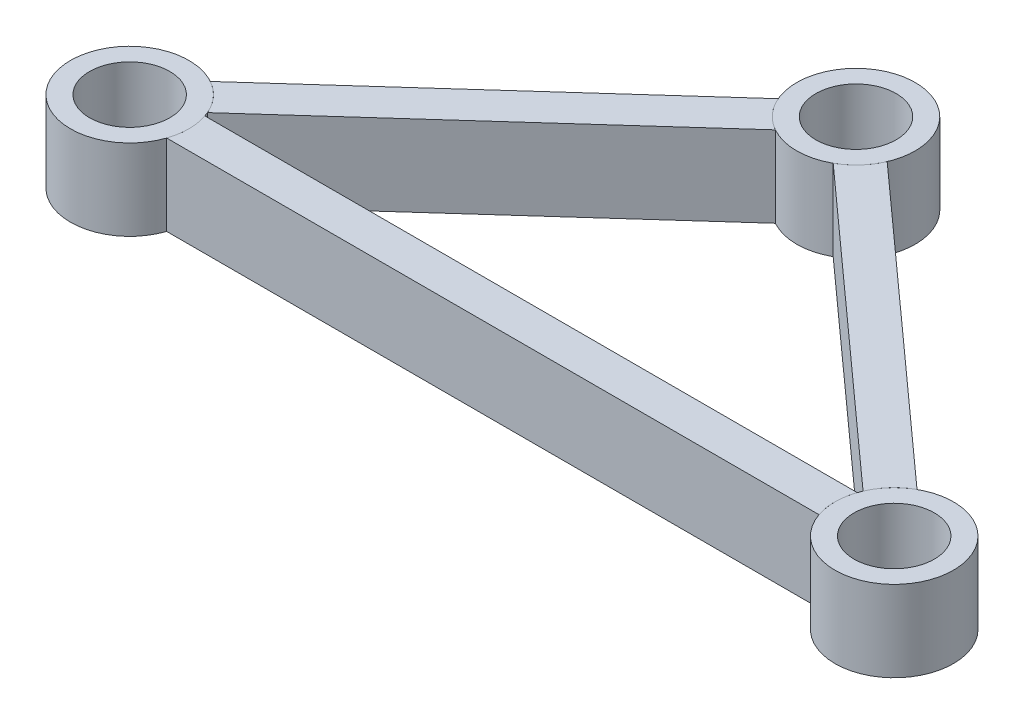
ISO-10303-21;
HEADER;
FILE_DESCRIPTION(('STEP AP214'),'2;1');
FILE_NAME('part.step','',(''),(''),'','','');
FILE_SCHEMA(('AUTOMOTIVE_DESIGN { 1 0 10303 214 1 1 1 1 }'));
ENDSEC;
DATA;
#1=APPLICATION_CONTEXT('core data for automotive mechanical design processes');
#2=APPLICATION_PROTOCOL_DEFINITION('international standard','automotive_design',2000,#1);
#3=PRODUCT_CONTEXT('',#1,'mechanical');
#4=PRODUCT('Part','Part','',(#3));
#5=PRODUCT_RELATED_PRODUCT_CATEGORY('part','',(#4));
#6=PRODUCT_DEFINITION_FORMATION('','',#4);
#7=PRODUCT_DEFINITION_CONTEXT('part definition',#1,'design');
#8=PRODUCT_DEFINITION('design','',#6,#7);
#9=PRODUCT_DEFINITION_SHAPE('','',#8);
#10=(LENGTH_UNIT() NAMED_UNIT(*) SI_UNIT(.MILLI.,.METRE.));
#11=(NAMED_UNIT(*) PLANE_ANGLE_UNIT() SI_UNIT($,.RADIAN.));
#12=(NAMED_UNIT(*) SI_UNIT($,.STERADIAN.) SOLID_ANGLE_UNIT());
#13=UNCERTAINTY_MEASURE_WITH_UNIT(LENGTH_MEASURE(1.E-05),#10,'distance_accuracy_value','');
#14=(GEOMETRIC_REPRESENTATION_CONTEXT(3) GLOBAL_UNCERTAINTY_ASSIGNED_CONTEXT((#13)) GLOBAL_UNIT_ASSIGNED_CONTEXT((#10,
#11,#12)) REPRESENTATION_CONTEXT('',''));
#15=CARTESIAN_POINT('',(0.,0.,0.));
#16=DIRECTION('',(0.,0.,1.));
#17=DIRECTION('',(1.,0.,0.));
#18=AXIS2_PLACEMENT_3D('',#15,#16,#17);
#19=CARTESIAN_POINT('',(60.,6.35,27.));
#20=DIRECTION('',(0.,-1.,0.));
#21=DIRECTION('',(0.,0.,-1.));
#22=AXIS2_PLACEMENT_3D('',#19,#20,#21);
#23=CYLINDRICAL_SURFACE('',#22,9.30000000000001);
#24=DIRECTION('',(0.,-1.,0.));
#25=VECTOR('',#24,1.);
#26=CARTESIAN_POINT('',(51.4500060278057,6.35,23.3410926391283));
#27=LINE('',#26,#25);
#28=CARTESIAN_POINT('',(51.4500060278057,6.35,23.3410926391283));
#29=VERTEX_POINT('',#28);
#30=CARTESIAN_POINT('',(51.4500060278057,-6.35,23.3410926391283));
#31=VERTEX_POINT('',#30);
#32=EDGE_CURVE('E115',#29,#31,#27,.T.);
#33=ORIENTED_EDGE('',*,*,#32,.T.);
#34=CARTESIAN_POINT('',(60.,-6.35,27.));
#35=DIRECTION('',(0.,1.,0.));
#36=DIRECTION('',(0.,0.,1.));
#37=AXIS2_PLACEMENT_3D('',#34,#35,#36);
#38=CIRCLE('',#37,9.30000000000001);
#39=CARTESIAN_POINT('',(55.4637944174488,-6.35,18.8813277615623));
#40=VERTEX_POINT('',#39);
#41=EDGE_CURVE('E61',#40,#31,#38,.T.);
#42=ORIENTED_EDGE('',*,*,#41,.F.);
#43=DIRECTION('',(0.,-1.,0.));
#44=VECTOR('',#43,1.);
#45=CARTESIAN_POINT('',(55.4637944175215,6.35,18.8813277616662));
#46=LINE('',#45,#44);
#47=CARTESIAN_POINT('',(55.4637944175215,6.35,18.8813277616662));
#48=VERTEX_POINT('',#47);
#49=EDGE_CURVE('E69',#40,#48,#46,.F.);
#50=ORIENTED_EDGE('',*,*,#49,.T.);
#51=CARTESIAN_POINT('',(60.,6.35,27.));
#52=DIRECTION('',(0.,-1.,0.));
#53=DIRECTION('',(0.,0.,-1.));
#54=AXIS2_PLACEMENT_3D('',#51,#52,#53);
#55=CIRCLE('',#54,9.30000000000001);
#56=EDGE_CURVE('E48',#48,#29,#55,.F.);
#57=ORIENTED_EDGE('',*,*,#56,.T.);
#58=EDGE_LOOP('',(#33,#42,#50,#57));
#59=FACE_BOUND('',#58,.T.);
#60=ADVANCED_FACE('F44',(#59),#23,.F.);
#61=CARTESIAN_POINT('',(500000.,-6.35,449977.036087214));
#62=DIRECTION('',(0.,1.,0.));
#63=DIRECTION('',(0.,0.,1.));
#64=AXIS2_PLACEMENT_3D('',#61,#62,#63);
#65=PLANE('',#64);
#66=DIRECTION('',(-0.743294146247166,0.,-0.66896473162245));
#67=VECTOR('',#66,1.);
#68=CARTESIAN_POINT('',(500004.01378839,-6.35,449972.576322336));
#69=LINE('',#68,#67);
#70=CARTESIAN_POINT('',(8.549993972224,-6.35,-23.3410926391571));
#71=VERTEX_POINT('',#70);
#72=EDGE_CURVE('E93',#40,#71,#69,.T.);
#73=ORIENTED_EDGE('',*,*,#72,.F.);
#74=ORIENTED_EDGE('',*,*,#41,.T.);
#75=DIRECTION('',(-0.743294146247166,0.,-0.66896473162245));
#76=VECTOR('',#75,1.);
#77=CARTESIAN_POINT('',(500000.,-6.35,449977.036087214));
#78=LINE('',#77,#76);
#79=CARTESIAN_POINT('',(4.53620558247847,-6.35,-18.8813277616662));
#80=VERTEX_POINT('',#79);
#81=EDGE_CURVE('E86',#31,#80,#78,.T.);
#82=ORIENTED_EDGE('',*,*,#81,.T.);
#83=CARTESIAN_POINT('',(0.,-6.35,-27.));
#84=DIRECTION('',(0.,1.,0.));
#85=DIRECTION('',(0.,0.,1.));
#86=AXIS2_PLACEMENT_3D('',#83,#84,#85);
#87=CIRCLE('',#86,9.3);
#88=EDGE_CURVE('E89',#80,#71,#87,.T.);
#89=ORIENTED_EDGE('',*,*,#88,.T.);
#90=EDGE_LOOP('',(#73,#74,#82,#89));
#91=FACE_BOUND('',#90,.T.);
#92=ADVANCED_FACE('F88',(#91),#65,.F.);
#93=CARTESIAN_POINT('',(500000.,6.35,449977.036087214));
#94=DIRECTION('',(0.66896473162245,0.,-0.743294146247166));
#95=DIRECTION('',(-0.743294146247166,0.,-0.66896473162245));
#96=AXIS2_PLACEMENT_3D('',#93,#94,#95);
#97=PLANE('',#96);
#98=ORIENTED_EDGE('',*,*,#32,.F.);
#99=DIRECTION('',(-0.743294146247166,0.,-0.66896473162245));
#100=VECTOR('',#99,1.);
#101=CARTESIAN_POINT('',(500000.,6.35,449977.036087214));
#102=LINE('',#101,#100);
#103=CARTESIAN_POINT('',(4.53620558247847,6.35,-18.8813277616662));
#104=VERTEX_POINT('',#103);
#105=EDGE_CURVE('E12',#29,#104,#102,.T.);
#106=ORIENTED_EDGE('',*,*,#105,.T.);
#107=DIRECTION('',(0.,-1.,0.));
#108=VECTOR('',#107,1.);
#109=CARTESIAN_POINT('',(4.53620558247847,6.35,-18.8813277616662));
#110=LINE('',#109,#108);
#111=EDGE_CURVE('E100',#104,#80,#110,.T.);
#112=ORIENTED_EDGE('',*,*,#111,.T.);
#113=ORIENTED_EDGE('',*,*,#81,.F.);
#114=EDGE_LOOP('',(#98,#106,#112,#113));
#115=FACE_BOUND('',#114,.T.);
#116=ADVANCED_FACE('F104',(#115),#97,.F.);
#117=CARTESIAN_POINT('',(500004.01378839,6.35,449972.576322336));
#118=DIRECTION('',(-0.66896473162245,0.,0.743294146247166));
#119=DIRECTION('',(0.743294146247166,0.,0.66896473162245));
#120=AXIS2_PLACEMENT_3D('',#117,#118,#119);
#121=PLANE('',#120);
#122=ORIENTED_EDGE('',*,*,#49,.F.);
#123=ORIENTED_EDGE('',*,*,#72,.T.);
#124=DIRECTION('',(0.,-1.,0.));
#125=VECTOR('',#124,1.);
#126=CARTESIAN_POINT('',(8.54999397221793,6.35,-23.3410926391835));
#127=LINE('',#126,#125);
#128=CARTESIAN_POINT('',(8.54999397221793,6.35,-23.3410926391835));
#129=VERTEX_POINT('',#128);
#130=EDGE_CURVE('E102',#71,#129,#127,.F.);
#131=ORIENTED_EDGE('',*,*,#130,.T.);
#132=DIRECTION('',(-0.743294146247166,0.,-0.66896473162245));
#133=VECTOR('',#132,1.);
#134=CARTESIAN_POINT('',(500004.01378839,6.35,449972.576322336));
#135=LINE('',#134,#133);
#136=EDGE_CURVE('E53',#48,#129,#135,.T.);
#137=ORIENTED_EDGE('',*,*,#136,.F.);
#138=EDGE_LOOP('',(#122,#123,#131,#137));
#139=FACE_BOUND('',#138,.T.);
#140=ADVANCED_FACE('F118',(#139),#121,.F.);
#141=CARTESIAN_POINT('',(500000.,6.35,449977.036087214));
#142=DIRECTION('',(0.,-1.,0.));
#143=DIRECTION('',(0.,0.,-1.));
#144=AXIS2_PLACEMENT_3D('',#141,#142,#143);
#145=PLANE('',#144);
#146=ORIENTED_EDGE('',*,*,#56,.F.);
#147=ORIENTED_EDGE('',*,*,#136,.T.);
#148=CARTESIAN_POINT('',(0.,6.35,-27.));
#149=DIRECTION('',(0.,1.,0.));
#150=DIRECTION('',(0.,0.,1.));
#151=AXIS2_PLACEMENT_3D('',#148,#149,#150);
#152=CIRCLE('',#151,9.3);
#153=EDGE_CURVE('E110',#129,#104,#152,.F.);
#154=ORIENTED_EDGE('',*,*,#153,.T.);
#155=ORIENTED_EDGE('',*,*,#105,.F.);
#156=EDGE_LOOP('',(#146,#147,#154,#155));
#157=FACE_BOUND('',#156,.T.);
#158=ADVANCED_FACE('F46',(#157),#145,.F.);
#159=CARTESIAN_POINT('',(0.,6.35,-27.));
#160=DIRECTION('',(0.,-1.,0.));
#161=DIRECTION('',(0.,0.,-1.));
#162=AXIS2_PLACEMENT_3D('',#159,#160,#161);
#163=CYLINDRICAL_SURFACE('',#162,9.3);
#164=ORIENTED_EDGE('',*,*,#88,.F.);
#165=ORIENTED_EDGE('',*,*,#111,.F.);
#166=ORIENTED_EDGE('',*,*,#153,.F.);
#167=ORIENTED_EDGE('',*,*,#130,.F.);
#168=EDGE_LOOP('',(#164,#165,#166,#167));
#169=FACE_BOUND('',#168,.T.);
#170=ADVANCED_FACE('F98',(#169),#163,.F.);
#171=CLOSED_SHELL('',(#60,#92,#116,#140,#158,#170));
#172=MANIFOLD_SOLID_BREP('B2',#171);
#173=CARTESIAN_POINT('',(-60.,6.35,27.));
#174=DIRECTION('',(0.,-1.,0.));
#175=DIRECTION('',(0.,0.,-1.));
#176=AXIS2_PLACEMENT_3D('',#173,#174,#175);
#177=CYLINDRICAL_SURFACE('',#176,9.30000000000001);
#178=DIRECTION('',(0.,-1.,0.));
#179=VECTOR('',#178,1.);
#180=CARTESIAN_POINT('',(-55.4637944174691,6.35,18.8813277616955));
#181=LINE('',#180,#179);
#182=CARTESIAN_POINT('',(-55.4637944174691,6.35,18.8813277616955));
#183=VERTEX_POINT('',#182);
#184=CARTESIAN_POINT('',(-55.4637944174691,-6.35,18.8813277616955));
#185=VERTEX_POINT('',#184);
#186=EDGE_CURVE('E246',#183,#185,#181,.T.);
#187=ORIENTED_EDGE('',*,*,#186,.T.);
#188=CARTESIAN_POINT('',(-60.,-6.35,27.));
#189=DIRECTION('',(0.,1.,0.));
#190=DIRECTION('',(0.,0.,1.));
#191=AXIS2_PLACEMENT_3D('',#188,#189,#190);
#192=CIRCLE('',#191,9.30000000000001);
#193=CARTESIAN_POINT('',(-51.4500060277783,-6.35,23.3410926391571));
#194=VERTEX_POINT('',#193);
#195=EDGE_CURVE('E195',#194,#185,#192,.T.);
#196=ORIENTED_EDGE('',*,*,#195,.F.);
#197=DIRECTION('',(0.,-1.,0.));
#198=VECTOR('',#197,1.);
#199=CARTESIAN_POINT('',(-51.4500060277821,6.35,23.3410926391835));
#200=LINE('',#199,#198);
#201=CARTESIAN_POINT('',(-51.4500060277821,6.35,23.3410926391835));
#202=VERTEX_POINT('',#201);
#203=EDGE_CURVE('E203',#194,#202,#200,.F.);
#204=ORIENTED_EDGE('',*,*,#203,.T.);
#205=CARTESIAN_POINT('',(-60.,6.35,27.));
#206=DIRECTION('',(0.,-1.,0.));
#207=DIRECTION('',(0.,0.,-1.));
#208=AXIS2_PLACEMENT_3D('',#205,#206,#207);
#209=CIRCLE('',#208,9.30000000000001);
#210=EDGE_CURVE('E243',#202,#183,#209,.F.);
#211=ORIENTED_EDGE('',*,*,#210,.T.);
#212=EDGE_LOOP('',(#187,#196,#204,#211));
#213=FACE_BOUND('',#212,.T.);
#214=ADVANCED_FACE('F178',(#213),#177,.F.);
#215=CARTESIAN_POINT('',(-500000.,-6.35,449968.963912786));
#216=DIRECTION('',(0.,1.,0.));
#217=DIRECTION('',(0.,0.,1.));
#218=AXIS2_PLACEMENT_3D('',#215,#216,#217);
#219=PLANE('',#218);
#220=DIRECTION('',(0.743294146247166,0.,-0.66896473162245));
#221=VECTOR('',#220,1.);
#222=CARTESIAN_POINT('',(-499995.98621161,-6.35,449973.423677663));
#223=LINE('',#222,#221);
#224=CARTESIAN_POINT('',(-4.53620558261036,-6.35,-18.8813277615054));
#225=VERTEX_POINT('',#224);
#226=EDGE_CURVE('E226',#194,#225,#223,.T.);
#227=ORIENTED_EDGE('',*,*,#226,.F.);
#228=ORIENTED_EDGE('',*,*,#195,.T.);
#229=DIRECTION('',(0.743294146247166,0.,-0.66896473162245));
#230=VECTOR('',#229,1.);
#231=CARTESIAN_POINT('',(-500000.,-6.35,449968.963912786));
#232=LINE('',#231,#230);
#233=CARTESIAN_POINT('',(-8.54999397219429,-6.35,-23.3410926391283));
#234=VERTEX_POINT('',#233);
#235=EDGE_CURVE('E182',#185,#234,#232,.T.);
#236=ORIENTED_EDGE('',*,*,#235,.T.);
#237=CARTESIAN_POINT('',(0.,-6.35,-27.));
#238=DIRECTION('',(0.,1.,0.));
#239=DIRECTION('',(0.,0.,1.));
#240=AXIS2_PLACEMENT_3D('',#237,#238,#239);
#241=CIRCLE('',#240,9.3);
#242=EDGE_CURVE('E222',#234,#225,#241,.T.);
#243=ORIENTED_EDGE('',*,*,#242,.T.);
#244=EDGE_LOOP('',(#227,#228,#236,#243));
#245=FACE_BOUND('',#244,.T.);
#246=ADVANCED_FACE('F221',(#245),#219,.F.);
#247=CARTESIAN_POINT('',(-500000.,6.35,449968.963912786));
#248=DIRECTION('',(0.66896473162245,0.,0.743294146247166));
#249=DIRECTION('',(0.743294146247166,0.,-0.66896473162245));
#250=AXIS2_PLACEMENT_3D('',#247,#248,#249);
#251=PLANE('',#250);
#252=ORIENTED_EDGE('',*,*,#186,.F.);
#253=DIRECTION('',(0.743294146247166,0.,-0.66896473162245));
#254=VECTOR('',#253,1.);
#255=CARTESIAN_POINT('',(-500000.,6.35,449968.963912786));
#256=LINE('',#255,#254);
#257=CARTESIAN_POINT('',(-8.54999397219429,6.35,-23.3410926391283));
#258=VERTEX_POINT('',#257);
#259=EDGE_CURVE('E42',#183,#258,#256,.T.);
#260=ORIENTED_EDGE('',*,*,#259,.T.);
#261=DIRECTION('',(0.,-1.,0.));
#262=VECTOR('',#261,1.);
#263=CARTESIAN_POINT('',(-8.54999397219429,6.35,-23.3410926391283));
#264=LINE('',#263,#262);
#265=EDGE_CURVE('E232',#258,#234,#264,.T.);
#266=ORIENTED_EDGE('',*,*,#265,.T.);
#267=ORIENTED_EDGE('',*,*,#235,.F.);
#268=EDGE_LOOP('',(#252,#260,#266,#267));
#269=FACE_BOUND('',#268,.T.);
#270=ADVANCED_FACE('F236',(#269),#251,.F.);
#271=CARTESIAN_POINT('',(-499995.98621161,6.35,449973.423677663));
#272=DIRECTION('',(-0.66896473162245,0.,-0.743294146247166));
#273=DIRECTION('',(-0.743294146247166,0.,0.66896473162245));
#274=AXIS2_PLACEMENT_3D('',#271,#272,#273);
#275=PLANE('',#274);
#276=ORIENTED_EDGE('',*,*,#203,.F.);
#277=ORIENTED_EDGE('',*,*,#226,.T.);
#278=DIRECTION('',(0.,-1.,0.));
#279=VECTOR('',#278,1.);
#280=CARTESIAN_POINT('',(-4.53620558247845,6.35,-18.8813277616662));
#281=LINE('',#280,#279);
#282=CARTESIAN_POINT('',(-4.53620558247845,6.35,-18.8813277616662));
#283=VERTEX_POINT('',#282);
#284=EDGE_CURVE('E234',#225,#283,#281,.F.);
#285=ORIENTED_EDGE('',*,*,#284,.T.);
#286=DIRECTION('',(0.743294146247166,0.,-0.66896473162245));
#287=VECTOR('',#286,1.);
#288=CARTESIAN_POINT('',(-499995.98621161,6.35,449973.423677663));
#289=LINE('',#288,#287);
#290=EDGE_CURVE('E187',#202,#283,#289,.T.);
#291=ORIENTED_EDGE('',*,*,#290,.F.);
#292=EDGE_LOOP('',(#276,#277,#285,#291));
#293=FACE_BOUND('',#292,.T.);
#294=ADVANCED_FACE('F180',(#293),#275,.F.);
#295=CARTESIAN_POINT('',(-500000.,6.35,449968.963912786));
#296=DIRECTION('',(0.,-1.,0.));
#297=DIRECTION('',(0.,0.,-1.));
#298=AXIS2_PLACEMENT_3D('',#295,#296,#297);
#299=PLANE('',#298);
#300=ORIENTED_EDGE('',*,*,#210,.F.);
#301=ORIENTED_EDGE('',*,*,#290,.T.);
#302=CARTESIAN_POINT('',(0.,6.35,-27.));
#303=DIRECTION('',(0.,1.,0.));
#304=DIRECTION('',(0.,0.,1.));
#305=AXIS2_PLACEMENT_3D('',#302,#303,#304);
#306=CIRCLE('',#305,9.3);
#307=EDGE_CURVE('E242',#283,#258,#306,.F.);
#308=ORIENTED_EDGE('',*,*,#307,.T.);
#309=ORIENTED_EDGE('',*,*,#259,.F.);
#310=EDGE_LOOP('',(#300,#301,#308,#309));
#311=FACE_BOUND('',#310,.T.);
#312=ADVANCED_FACE('F251',(#311),#299,.F.);
#313=CARTESIAN_POINT('',(0.,6.35,-27.));
#314=DIRECTION('',(0.,-1.,0.));
#315=DIRECTION('',(0.,0.,-1.));
#316=AXIS2_PLACEMENT_3D('',#313,#314,#315);
#317=CYLINDRICAL_SURFACE('',#316,9.3);
#318=ORIENTED_EDGE('',*,*,#242,.F.);
#319=ORIENTED_EDGE('',*,*,#265,.F.);
#320=ORIENTED_EDGE('',*,*,#307,.F.);
#321=ORIENTED_EDGE('',*,*,#284,.F.);
#322=EDGE_LOOP('',(#318,#319,#320,#321));
#323=FACE_BOUND('',#322,.T.);
#324=ADVANCED_FACE('F230',(#323),#317,.F.);
#325=CLOSED_SHELL('',(#214,#246,#270,#294,#312,#324));
#326=MANIFOLD_SOLID_BREP('B6',#325);
#327=CARTESIAN_POINT('',(-60.,6.35,27.));
#328=DIRECTION('',(0.,-1.,0.));
#329=DIRECTION('',(0.,0.,-1.));
#330=AXIS2_PLACEMENT_3D('',#327,#328,#329);
#331=CYLINDRICAL_SURFACE('',#330,9.30000000000001);
#332=CARTESIAN_POINT('',(-60.,6.35,27.));
#333=DIRECTION('',(0.,1.,0.));
#334=DIRECTION('',(0.,0.,1.));
#335=AXIS2_PLACEMENT_3D('',#332,#333,#334);
#336=CIRCLE('',#335,9.30000000000001);
#337=CARTESIAN_POINT('',(-51.1971595493273,6.35,24.));
#338=VERTEX_POINT('',#337);
#339=CARTESIAN_POINT('',(-51.1971595493272,6.35,30.));
#340=VERTEX_POINT('',#339);
#341=EDGE_CURVE('E358',#338,#340,#336,.F.);
#342=ORIENTED_EDGE('',*,*,#341,.F.);
#343=DIRECTION('',(0.,-1.,0.));
#344=VECTOR('',#343,1.);
#345=CARTESIAN_POINT('',(-51.1971595493273,6.35,24.));
#346=LINE('',#345,#344);
#347=CARTESIAN_POINT('',(-51.1971595494174,-6.35,24.));
#348=VERTEX_POINT('',#347);
#349=EDGE_CURVE('E327',#348,#338,#346,.F.);
#350=ORIENTED_EDGE('',*,*,#349,.F.);
#351=CARTESIAN_POINT('',(-60.,-6.35,27.));
#352=DIRECTION('',(0.,1.,0.));
#353=DIRECTION('',(0.,0.,1.));
#354=AXIS2_PLACEMENT_3D('',#351,#352,#353);
#355=CIRCLE('',#354,9.30000000000001);
#356=CARTESIAN_POINT('',(-51.1971595493272,-6.35,30.));
#357=VERTEX_POINT('',#356);
#358=EDGE_CURVE('E379',#357,#348,#355,.T.);
#359=ORIENTED_EDGE('',*,*,#358,.F.);
#360=DIRECTION('',(0.,-1.,0.));
#361=VECTOR('',#360,1.);
#362=CARTESIAN_POINT('',(-51.1971595493272,6.35,30.));
#363=LINE('',#362,#361);
#364=EDGE_CURVE('E334',#340,#357,#363,.T.);
#365=ORIENTED_EDGE('',*,*,#364,.F.);
#366=EDGE_LOOP('',(#342,#350,#359,#365));
#367=FACE_BOUND('',#366,.T.);
#368=ADVANCED_FACE('F310',(#367),#331,.F.);
#369=CARTESIAN_POINT('',(-500000.,-6.35,30.));
#370=DIRECTION('',(0.,-1.,0.));
#371=DIRECTION('',(0.,0.,-1.));
#372=AXIS2_PLACEMENT_3D('',#369,#370,#371);
#373=PLANE('',#372);
#374=DIRECTION('',(1.,0.,0.));
#375=VECTOR('',#374,1.);
#376=CARTESIAN_POINT('',(-500000.,-6.35,30.));
#377=LINE('',#376,#375);
#378=CARTESIAN_POINT('',(51.1971595493273,-6.35,30.));
#379=VERTEX_POINT('',#378);
#380=EDGE_CURVE('E314',#357,#379,#377,.T.);
#381=ORIENTED_EDGE('',*,*,#380,.F.);
#382=ORIENTED_EDGE('',*,*,#358,.T.);
#383=DIRECTION('',(1.,0.,0.));
#384=VECTOR('',#383,1.);
#385=CARTESIAN_POINT('',(-500000.,-6.35,24.));
#386=LINE('',#385,#384);
#387=CARTESIAN_POINT('',(51.1971595494174,-6.35,24.));
#388=VERTEX_POINT('',#387);
#389=EDGE_CURVE('E382',#348,#388,#386,.T.);
#390=ORIENTED_EDGE('',*,*,#389,.T.);
#391=CARTESIAN_POINT('',(60.,-6.35,27.));
#392=DIRECTION('',(0.,1.,0.));
#393=DIRECTION('',(0.,0.,1.));
#394=AXIS2_PLACEMENT_3D('',#391,#392,#393);
#395=CIRCLE('',#394,9.30000000000001);
#396=EDGE_CURVE('E372',#388,#379,#395,.T.);
#397=ORIENTED_EDGE('',*,*,#396,.T.);
#398=EDGE_LOOP('',(#381,#382,#390,#397));
#399=FACE_BOUND('',#398,.T.);
#400=ADVANCED_FACE('F384',(#399),#373,.T.);
#401=CARTESIAN_POINT('',(-500000.,6.35,30.));
#402=DIRECTION('',(0.,0.,1.));
#403=DIRECTION('',(1.,0.,0.));
#404=AXIS2_PLACEMENT_3D('',#401,#402,#403);
#405=PLANE('',#404);
#406=DIRECTION('',(1.,0.,0.));
#407=VECTOR('',#406,1.);
#408=CARTESIAN_POINT('',(-500000.,6.35,30.));
#409=LINE('',#408,#407);
#410=CARTESIAN_POINT('',(51.1971595493273,6.35,30.));
#411=VERTEX_POINT('',#410);
#412=EDGE_CURVE('E176',#340,#411,#409,.T.);
#413=ORIENTED_EDGE('',*,*,#412,.F.);
#414=ORIENTED_EDGE('',*,*,#364,.T.);
#415=ORIENTED_EDGE('',*,*,#380,.T.);
#416=DIRECTION('',(0.,-1.,0.));
#417=VECTOR('',#416,1.);
#418=CARTESIAN_POINT('',(51.1971595493273,6.35,30.));
#419=LINE('',#418,#417);
#420=EDGE_CURVE('E365',#411,#379,#419,.T.);
#421=ORIENTED_EDGE('',*,*,#420,.F.);
#422=EDGE_LOOP('',(#413,#414,#415,#421));
#423=FACE_BOUND('',#422,.T.);
#424=ADVANCED_FACE('F369',(#423),#405,.T.);
#425=CARTESIAN_POINT('',(-500000.,6.35,24.));
#426=DIRECTION('',(0.,0.,-1.));
#427=DIRECTION('',(-1.,0.,0.));
#428=AXIS2_PLACEMENT_3D('',#425,#426,#427);
#429=PLANE('',#428);
#430=ORIENTED_EDGE('',*,*,#389,.F.);
#431=ORIENTED_EDGE('',*,*,#349,.T.);
#432=DIRECTION('',(1.,0.,0.));
#433=VECTOR('',#432,1.);
#434=CARTESIAN_POINT('',(-500000.,6.35,24.));
#435=LINE('',#434,#433);
#436=CARTESIAN_POINT('',(51.1971595493273,6.35,24.));
#437=VERTEX_POINT('',#436);
#438=EDGE_CURVE('E319',#338,#437,#435,.T.);
#439=ORIENTED_EDGE('',*,*,#438,.T.);
#440=DIRECTION('',(0.,-1.,0.));
#441=VECTOR('',#440,1.);
#442=CARTESIAN_POINT('',(51.1971595493273,6.35,24.));
#443=LINE('',#442,#441);
#444=EDGE_CURVE('E367',#388,#437,#443,.F.);
#445=ORIENTED_EDGE('',*,*,#444,.F.);
#446=EDGE_LOOP('',(#430,#431,#439,#445));
#447=FACE_BOUND('',#446,.T.);
#448=ADVANCED_FACE('F312',(#447),#429,.T.);
#449=CARTESIAN_POINT('',(-500000.,6.35,30.));
#450=DIRECTION('',(0.,1.,0.));
#451=DIRECTION('',(0.,0.,1.));
#452=AXIS2_PLACEMENT_3D('',#449,#450,#451);
#453=PLANE('',#452);
#454=ORIENTED_EDGE('',*,*,#438,.F.);
#455=ORIENTED_EDGE('',*,*,#341,.T.);
#456=ORIENTED_EDGE('',*,*,#412,.T.);
#457=CARTESIAN_POINT('',(60.,6.35,27.));
#458=DIRECTION('',(0.,-1.,0.));
#459=DIRECTION('',(0.,0.,-1.));
#460=AXIS2_PLACEMENT_3D('',#457,#458,#459);
#461=CIRCLE('',#460,9.30000000000001);
#462=EDGE_CURVE('E356',#437,#411,#461,.F.);
#463=ORIENTED_EDGE('',*,*,#462,.F.);
#464=EDGE_LOOP('',(#454,#455,#456,#463));
#465=FACE_BOUND('',#464,.T.);
#466=ADVANCED_FACE('F355',(#465),#453,.T.);
#467=CARTESIAN_POINT('',(60.,6.35,27.));
#468=DIRECTION('',(0.,-1.,0.));
#469=DIRECTION('',(0.,0.,-1.));
#470=AXIS2_PLACEMENT_3D('',#467,#468,#469);
#471=CYLINDRICAL_SURFACE('',#470,9.30000000000001);
#472=ORIENTED_EDGE('',*,*,#420,.T.);
#473=ORIENTED_EDGE('',*,*,#396,.F.);
#474=ORIENTED_EDGE('',*,*,#444,.T.);
#475=ORIENTED_EDGE('',*,*,#462,.T.);
#476=EDGE_LOOP('',(#472,#473,#474,#475));
#477=FACE_BOUND('',#476,.T.);
#478=ADVANCED_FACE('F363',(#477),#471,.F.);
#479=CLOSED_SHELL('',(#368,#400,#424,#448,#466,#478));
#480=MANIFOLD_SOLID_BREP('B36',#479);
#481=CARTESIAN_POINT('',(-60.,6.35,27.));
#482=DIRECTION('',(0.,1.,0.));
#483=DIRECTION('',(0.,0.,1.));
#484=AXIS2_PLACEMENT_3D('',#481,#482,#483);
#485=PLANE('',#484);
#486=CARTESIAN_POINT('',(-60.,6.35,27.));
#487=DIRECTION('',(0.,1.,0.));
#488=DIRECTION('',(0.,0.,1.));
#489=AXIS2_PLACEMENT_3D('',#486,#487,#488);
#490=CIRCLE('',#489,9.30000000000001);
#491=CARTESIAN_POINT('',(-60.,6.35,36.3));
#492=VERTEX_POINT('',#491);
#493=EDGE_CURVE('E309',#492,#492,#490,.T.);
#494=ORIENTED_EDGE('',*,*,#493,.T.);
#495=EDGE_LOOP('',(#494));
#496=FACE_BOUND('',#495,.T.);
#497=CARTESIAN_POINT('',(-60.,6.35,27.));
#498=DIRECTION('',(0.,1.,0.));
#499=DIRECTION('',(0.,0.,1.));
#500=AXIS2_PLACEMENT_3D('',#497,#498,#499);
#501=CIRCLE('',#500,6.3);
#502=CARTESIAN_POINT('',(-60.,6.35,33.3));
#503=VERTEX_POINT('',#502);
#504=EDGE_CURVE('E453',#503,#503,#501,.T.);
#505=ORIENTED_EDGE('',*,*,#504,.F.);
#506=EDGE_LOOP('',(#505));
#507=FACE_BOUND('',#506,.T.);
#508=ADVANCED_FACE('F442',(#496,#507),#485,.T.);
#509=CARTESIAN_POINT('',(-60.,-6.35,27.));
#510=DIRECTION('',(0.,1.,0.));
#511=DIRECTION('',(0.,0.,1.));
#512=AXIS2_PLACEMENT_3D('',#509,#510,#511);
#513=PLANE('',#512);
#514=CARTESIAN_POINT('',(-60.,-6.35,27.));
#515=DIRECTION('',(0.,1.,0.));
#516=DIRECTION('',(0.,0.,1.));
#517=AXIS2_PLACEMENT_3D('',#514,#515,#516);
#518=CIRCLE('',#517,9.30000000000001);
#519=CARTESIAN_POINT('',(-60.,-6.35,36.3));
#520=VERTEX_POINT('',#519);
#521=EDGE_CURVE('E446',#520,#520,#518,.T.);
#522=ORIENTED_EDGE('',*,*,#521,.F.);
#523=EDGE_LOOP('',(#522));
#524=FACE_BOUND('',#523,.T.);
#525=CARTESIAN_POINT('',(-60.,-6.35,27.));
#526=DIRECTION('',(0.,1.,0.));
#527=DIRECTION('',(0.,0.,1.));
#528=AXIS2_PLACEMENT_3D('',#525,#526,#527);
#529=CIRCLE('',#528,6.3);
#530=CARTESIAN_POINT('',(-60.,-6.35,33.3));
#531=VERTEX_POINT('',#530);
#532=EDGE_CURVE('E455',#531,#531,#529,.T.);
#533=ORIENTED_EDGE('',*,*,#532,.T.);
#534=EDGE_LOOP('',(#533));
#535=FACE_BOUND('',#534,.T.);
#536=ADVANCED_FACE('F465',(#524,#535),#513,.F.);
#537=CARTESIAN_POINT('',(-60.,6.35,27.));
#538=DIRECTION('',(0.,-1.,0.));
#539=DIRECTION('',(0.,0.,-1.));
#540=AXIS2_PLACEMENT_3D('',#537,#538,#539);
#541=CYLINDRICAL_SURFACE('',#540,9.30000000000001);
#542=ORIENTED_EDGE('',*,*,#493,.F.);
#543=EDGE_LOOP('',(#542));
#544=FACE_BOUND('',#543,.T.);
#545=ORIENTED_EDGE('',*,*,#521,.T.);
#546=EDGE_LOOP('',(#545));
#547=FACE_BOUND('',#546,.T.);
#548=ADVANCED_FACE('F444',(#544,#547),#541,.T.);
#549=CARTESIAN_POINT('',(-60.,6.35,27.));
#550=DIRECTION('',(0.,-1.,0.));
#551=DIRECTION('',(0.,0.,-1.));
#552=AXIS2_PLACEMENT_3D('',#549,#550,#551);
#553=CYLINDRICAL_SURFACE('',#552,6.3);
#554=ORIENTED_EDGE('',*,*,#504,.T.);
#555=EDGE_LOOP('',(#554));
#556=FACE_BOUND('',#555,.T.);
#557=ORIENTED_EDGE('',*,*,#532,.F.);
#558=EDGE_LOOP('',(#557));
#559=FACE_BOUND('',#558,.T.);
#560=ADVANCED_FACE('F461',(#556,#559),#553,.F.);
#561=CLOSED_SHELL('',(#508,#536,#548,#560));
#562=MANIFOLD_SOLID_BREP('B170',#561);
#563=CARTESIAN_POINT('',(0.,6.35,-27.));
#564=DIRECTION('',(0.,1.,0.));
#565=DIRECTION('',(0.,0.,1.));
#566=AXIS2_PLACEMENT_3D('',#563,#564,#565);
#567=PLANE('',#566);
#568=CARTESIAN_POINT('',(0.,6.35,-27.));
#569=DIRECTION('',(0.,1.,0.));
#570=DIRECTION('',(0.,0.,1.));
#571=AXIS2_PLACEMENT_3D('',#568,#569,#570);
#572=CIRCLE('',#571,9.3);
#573=CARTESIAN_POINT('',(0.,6.35,-17.7));
#574=VERTEX_POINT('',#573);
#575=EDGE_CURVE('E441',#574,#574,#572,.T.);
#576=ORIENTED_EDGE('',*,*,#575,.T.);
#577=EDGE_LOOP('',(#576));
#578=FACE_BOUND('',#577,.T.);
#579=CARTESIAN_POINT('',(0.,6.35,-27.));
#580=DIRECTION('',(0.,1.,0.));
#581=DIRECTION('',(0.,0.,1.));
#582=AXIS2_PLACEMENT_3D('',#579,#580,#581);
#583=CIRCLE('',#582,6.3);
#584=CARTESIAN_POINT('',(0.,6.35,-20.7));
#585=VERTEX_POINT('',#584);
#586=EDGE_CURVE('E522',#585,#585,#583,.T.);
#587=ORIENTED_EDGE('',*,*,#586,.F.);
#588=EDGE_LOOP('',(#587));
#589=FACE_BOUND('',#588,.T.);
#590=ADVANCED_FACE('F511',(#578,#589),#567,.T.);
#591=CARTESIAN_POINT('',(0.,-6.35,-27.));
#592=DIRECTION('',(0.,1.,0.));
#593=DIRECTION('',(0.,0.,1.));
#594=AXIS2_PLACEMENT_3D('',#591,#592,#593);
#595=PLANE('',#594);
#596=CARTESIAN_POINT('',(0.,-6.35,-27.));
#597=DIRECTION('',(0.,1.,0.));
#598=DIRECTION('',(0.,0.,1.));
#599=AXIS2_PLACEMENT_3D('',#596,#597,#598);
#600=CIRCLE('',#599,9.3);
#601=CARTESIAN_POINT('',(0.,-6.35,-17.7));
#602=VERTEX_POINT('',#601);
#603=EDGE_CURVE('E515',#602,#602,#600,.T.);
#604=ORIENTED_EDGE('',*,*,#603,.F.);
#605=EDGE_LOOP('',(#604));
#606=FACE_BOUND('',#605,.T.);
#607=CARTESIAN_POINT('',(0.,-6.35,-27.));
#608=DIRECTION('',(0.,1.,0.));
#609=DIRECTION('',(0.,0.,1.));
#610=AXIS2_PLACEMENT_3D('',#607,#608,#609);
#611=CIRCLE('',#610,6.3);
#612=CARTESIAN_POINT('',(0.,-6.35,-20.7));
#613=VERTEX_POINT('',#612);
#614=EDGE_CURVE('E524',#613,#613,#611,.T.);
#615=ORIENTED_EDGE('',*,*,#614,.T.);
#616=EDGE_LOOP('',(#615));
#617=FACE_BOUND('',#616,.T.);
#618=ADVANCED_FACE('F534',(#606,#617),#595,.F.);
#619=CARTESIAN_POINT('',(0.,6.35,-27.));
#620=DIRECTION('',(0.,-1.,0.));
#621=DIRECTION('',(0.,0.,-1.));
#622=AXIS2_PLACEMENT_3D('',#619,#620,#621);
#623=CYLINDRICAL_SURFACE('',#622,9.3);
#624=ORIENTED_EDGE('',*,*,#575,.F.);
#625=EDGE_LOOP('',(#624));
#626=FACE_BOUND('',#625,.T.);
#627=ORIENTED_EDGE('',*,*,#603,.T.);
#628=EDGE_LOOP('',(#627));
#629=FACE_BOUND('',#628,.T.);
#630=ADVANCED_FACE('F513',(#626,#629),#623,.T.);
#631=CARTESIAN_POINT('',(0.,6.35,-27.));
#632=DIRECTION('',(0.,-1.,0.));
#633=DIRECTION('',(0.,0.,-1.));
#634=AXIS2_PLACEMENT_3D('',#631,#632,#633);
#635=CYLINDRICAL_SURFACE('',#634,6.3);
#636=ORIENTED_EDGE('',*,*,#586,.T.);
#637=EDGE_LOOP('',(#636));
#638=FACE_BOUND('',#637,.T.);
#639=ORIENTED_EDGE('',*,*,#614,.F.);
#640=EDGE_LOOP('',(#639));
#641=FACE_BOUND('',#640,.T.);
#642=ADVANCED_FACE('F530',(#638,#641),#635,.F.);
#643=CLOSED_SHELL('',(#590,#618,#630,#642));
#644=MANIFOLD_SOLID_BREP('B304',#643);
#645=CARTESIAN_POINT('',(60.,6.35,27.));
#646=DIRECTION('',(0.,1.,0.));
#647=DIRECTION('',(0.,0.,1.));
#648=AXIS2_PLACEMENT_3D('',#645,#646,#647);
#649=PLANE('',#648);
#650=CARTESIAN_POINT('',(60.,6.35,27.));
#651=DIRECTION('',(0.,1.,0.));
#652=DIRECTION('',(0.,0.,1.));
#653=AXIS2_PLACEMENT_3D('',#650,#651,#652);
#654=CIRCLE('',#653,9.30000000000001);
#655=CARTESIAN_POINT('',(60.,6.35,36.3));
#656=VERTEX_POINT('',#655);
#657=EDGE_CURVE('E510',#656,#656,#654,.T.);
#658=ORIENTED_EDGE('',*,*,#657,.T.);
#659=EDGE_LOOP('',(#658));
#660=FACE_BOUND('',#659,.T.);
#661=CARTESIAN_POINT('',(60.,6.35,27.));
#662=DIRECTION('',(0.,1.,0.));
#663=DIRECTION('',(0.,0.,1.));
#664=AXIS2_PLACEMENT_3D('',#661,#662,#663);
#665=CIRCLE('',#664,6.3);
#666=CARTESIAN_POINT('',(60.,6.35,33.3));
#667=VERTEX_POINT('',#666);
#668=EDGE_CURVE('E584',#667,#667,#665,.T.);
#669=ORIENTED_EDGE('',*,*,#668,.F.);
#670=EDGE_LOOP('',(#669));
#671=FACE_BOUND('',#670,.T.);
#672=ADVANCED_FACE('F573',(#660,#671),#649,.T.);
#673=CARTESIAN_POINT('',(60.,-6.35,27.));
#674=DIRECTION('',(0.,1.,0.));
#675=DIRECTION('',(0.,0.,1.));
#676=AXIS2_PLACEMENT_3D('',#673,#674,#675);
#677=PLANE('',#676);
#678=CARTESIAN_POINT('',(60.,-6.35,27.));
#679=DIRECTION('',(0.,1.,0.));
#680=DIRECTION('',(0.,0.,1.));
#681=AXIS2_PLACEMENT_3D('',#678,#679,#680);
#682=CIRCLE('',#681,9.30000000000001);
#683=CARTESIAN_POINT('',(60.,-6.35,36.3));
#684=VERTEX_POINT('',#683);
#685=EDGE_CURVE('E577',#684,#684,#682,.T.);
#686=ORIENTED_EDGE('',*,*,#685,.F.);
#687=EDGE_LOOP('',(#686));
#688=FACE_BOUND('',#687,.T.);
#689=CARTESIAN_POINT('',(60.,-6.35,27.));
#690=DIRECTION('',(0.,1.,0.));
#691=DIRECTION('',(0.,0.,1.));
#692=AXIS2_PLACEMENT_3D('',#689,#690,#691);
#693=CIRCLE('',#692,6.3);
#694=CARTESIAN_POINT('',(60.,-6.35,33.3));
#695=VERTEX_POINT('',#694);
#696=EDGE_CURVE('E586',#695,#695,#693,.T.);
#697=ORIENTED_EDGE('',*,*,#696,.T.);
#698=EDGE_LOOP('',(#697));
#699=FACE_BOUND('',#698,.T.);
#700=ADVANCED_FACE('F596',(#688,#699),#677,.F.);
#701=CARTESIAN_POINT('',(60.,6.35,27.));
#702=DIRECTION('',(0.,-1.,0.));
#703=DIRECTION('',(0.,0.,-1.));
#704=AXIS2_PLACEMENT_3D('',#701,#702,#703);
#705=CYLINDRICAL_SURFACE('',#704,9.30000000000001);
#706=ORIENTED_EDGE('',*,*,#657,.F.);
#707=EDGE_LOOP('',(#706));
#708=FACE_BOUND('',#707,.T.);
#709=ORIENTED_EDGE('',*,*,#685,.T.);
#710=EDGE_LOOP('',(#709));
#711=FACE_BOUND('',#710,.T.);
#712=ADVANCED_FACE('F575',(#708,#711),#705,.T.);
#713=CARTESIAN_POINT('',(60.,6.35,27.));
#714=DIRECTION('',(0.,-1.,0.));
#715=DIRECTION('',(0.,0.,-1.));
#716=AXIS2_PLACEMENT_3D('',#713,#714,#715);
#717=CYLINDRICAL_SURFACE('',#716,6.3);
#718=ORIENTED_EDGE('',*,*,#668,.T.);
#719=EDGE_LOOP('',(#718));
#720=FACE_BOUND('',#719,.T.);
#721=ORIENTED_EDGE('',*,*,#696,.F.);
#722=EDGE_LOOP('',(#721));
#723=FACE_BOUND('',#722,.T.);
#724=ADVANCED_FACE('F592',(#720,#723),#717,.F.);
#725=CLOSED_SHELL('',(#672,#700,#712,#724));
#726=MANIFOLD_SOLID_BREP('B436',#725);
#727=ADVANCED_BREP_SHAPE_REPRESENTATION('',(#18,#172,#326,#480,#562,#644,#726),#14);
#728=SHAPE_DEFINITION_REPRESENTATION(#9,#727);
ENDSEC;
END-ISO-10303-21;
